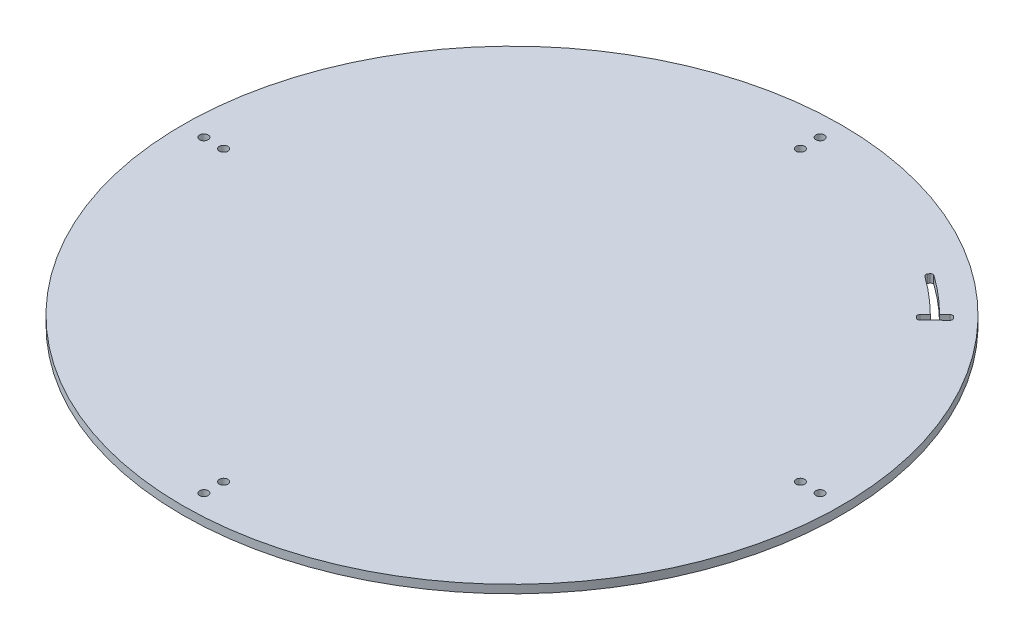
ISO-10303-21;
HEADER;
FILE_DESCRIPTION(('STEP AP214'),'2;1');
FILE_NAME('part.step','',(''),(''),'','','');
FILE_SCHEMA(('AUTOMOTIVE_DESIGN { 1 0 10303 214 1 1 1 1 }'));
ENDSEC;
DATA;
#1=APPLICATION_CONTEXT('core data for automotive mechanical design processes');
#2=APPLICATION_PROTOCOL_DEFINITION('international standard','automotive_design',2000,#1);
#3=PRODUCT_CONTEXT('',#1,'mechanical');
#4=PRODUCT('Part','Part','',(#3));
#5=PRODUCT_RELATED_PRODUCT_CATEGORY('part','',(#4));
#6=PRODUCT_DEFINITION_FORMATION('','',#4);
#7=PRODUCT_DEFINITION_CONTEXT('part definition',#1,'design');
#8=PRODUCT_DEFINITION('design','',#6,#7);
#9=PRODUCT_DEFINITION_SHAPE('','',#8);
#10=(LENGTH_UNIT() NAMED_UNIT(*) SI_UNIT(.MILLI.,.METRE.));
#11=(NAMED_UNIT(*) PLANE_ANGLE_UNIT() SI_UNIT($,.RADIAN.));
#12=(NAMED_UNIT(*) SI_UNIT($,.STERADIAN.) SOLID_ANGLE_UNIT());
#13=UNCERTAINTY_MEASURE_WITH_UNIT(LENGTH_MEASURE(1.E-05),#10,'distance_accuracy_value','');
#14=(GEOMETRIC_REPRESENTATION_CONTEXT(3) GLOBAL_UNCERTAINTY_ASSIGNED_CONTEXT((#13)) GLOBAL_UNIT_ASSIGNED_CONTEXT((#10,
#11,#12)) REPRESENTATION_CONTEXT('',''));
#15=CARTESIAN_POINT('',(0.,0.,0.));
#16=DIRECTION('',(0.,0.,1.));
#17=DIRECTION('',(1.,0.,0.));
#18=AXIS2_PLACEMENT_3D('',#15,#16,#17);
#19=CARTESIAN_POINT('',(0.,5.,0.));
#20=DIRECTION('',(0.,-1.,0.));
#21=DIRECTION('',(0.,0.,-1.));
#22=AXIS2_PLACEMENT_3D('',#19,#20,#21);
#23=CYLINDRICAL_SURFACE('',#22,200.);
#24=CARTESIAN_POINT('',(0.,5.,0.));
#25=DIRECTION('',(0.,1.,0.));
#26=DIRECTION('',(0.,0.,1.));
#27=AXIS2_PLACEMENT_3D('',#24,#25,#26);
#28=CIRCLE('',#27,200.);
#29=CARTESIAN_POINT('',(0.,5.,200.));
#30=VERTEX_POINT('',#29);
#31=EDGE_CURVE('E212',#30,#30,#28,.T.);
#32=ORIENTED_EDGE('',*,*,#31,.F.);
#33=EDGE_LOOP('',(#32));
#34=FACE_BOUND('',#33,.T.);
#35=CARTESIAN_POINT('',(0.,0.,0.));
#36=DIRECTION('',(0.,1.,0.));
#37=DIRECTION('',(0.,0.,1.));
#38=AXIS2_PLACEMENT_3D('',#35,#36,#37);
#39=CIRCLE('',#38,200.);
#40=CARTESIAN_POINT('',(0.,0.,200.));
#41=VERTEX_POINT('',#40);
#42=EDGE_CURVE('E207',#41,#41,#39,.T.);
#43=ORIENTED_EDGE('',*,*,#42,.T.);
#44=EDGE_LOOP('',(#43));
#45=FACE_BOUND('',#44,.T.);
#46=ADVANCED_FACE('F35',(#34,#45),#23,.T.);
#47=CARTESIAN_POINT('',(0.,5.,0.));
#48=DIRECTION('',(0.,1.,0.));
#49=DIRECTION('',(0.,0.,1.));
#50=AXIS2_PLACEMENT_3D('',#47,#48,#49);
#51=PLANE('',#50);
#52=DIRECTION('',(-0.707106781186547,0.,0.707106781186548));
#53=VECTOR('',#52,1.);
#54=CARTESIAN_POINT('',(122.328963701289,5.,-123.036070482476));
#55=LINE('',#54,#53);
#56=CARTESIAN_POINT('',(126.571621417244,5.,-127.27872819843));
#57=VERTEX_POINT('',#56);
#58=CARTESIAN_POINT('',(123.388112995471,5.,-124.095219776657));
#59=VERTEX_POINT('',#58);
#60=EDGE_CURVE('E135',#57,#59,#55,.T.);
#61=ORIENTED_EDGE('',*,*,#60,.F.);
#62=CARTESIAN_POINT('',(0.,5.,0.));
#63=DIRECTION('',(0.,1.,0.));
#64=DIRECTION('',(0.,0.,1.));
#65=AXIS2_PLACEMENT_3D('',#62,#63,#64);
#66=CIRCLE('',#65,179.5);
#67=CARTESIAN_POINT('',(104.737213772786,5.,-145.775052910687));
#68=VERTEX_POINT('',#67);
#69=EDGE_CURVE('E146',#68,#57,#66,.F.);
#70=ORIENTED_EDGE('',*,*,#69,.F.);
#71=CARTESIAN_POINT('',(105.612455113506,5.,-146.993228840303));
#72=DIRECTION('',(0.,1.,0.));
#73=DIRECTION('',(0.,0.,1.));
#74=AXIS2_PLACEMENT_3D('',#71,#72,#73);
#75=CIRCLE('',#74,1.5);
#76=CARTESIAN_POINT('',(104.387067635019,5.,-147.858344744428));
#77=VERTEX_POINT('',#76);
#78=EDGE_CURVE('E236',#68,#77,#75,.F.);
#79=ORIENTED_EDGE('',*,*,#78,.T.);
#80=DIRECTION('',(-0.57674393608276,0.,0.816924985657659));
#81=VECTOR('',#80,1.);
#82=CARTESIAN_POINT('',(0.,5.,0.));
#83=LINE('',#82,#81);
#84=CARTESIAN_POINT('',(104.963831268454,5.,-148.675297630264));
#85=VERTEX_POINT('',#84);
#86=EDGE_CURVE('E155',#85,#77,#83,.T.);
#87=ORIENTED_EDGE('',*,*,#86,.F.);
#88=CARTESIAN_POINT('',(106.18921874694,5.,-147.81018172614));
#89=DIRECTION('',(0.,1.,0.));
#90=DIRECTION('',(0.,0.,1.));
#91=AXIS2_PLACEMENT_3D('',#88,#89,#90);
#92=CIRCLE('',#91,1.5);
#93=CARTESIAN_POINT('',(107.064404615734,5.,-149.028397509597));
#94=VERTEX_POINT('',#93);
#95=EDGE_CURVE('E238',#85,#94,#92,.F.);
#96=ORIENTED_EDGE('',*,*,#95,.T.);
#97=CARTESIAN_POINT('',(0.,5.,0.));
#98=DIRECTION('',(0.,1.,0.));
#99=DIRECTION('',(0.,0.,1.));
#100=AXIS2_PLACEMENT_3D('',#97,#98,#99);
#101=CIRCLE('',#100,183.5);
#102=CARTESIAN_POINT('',(129.400059275875,5.,-130.107166057062));
#103=VERTEX_POINT('',#102);
#104=EDGE_CURVE('E154',#103,#94,#101,.T.);
#105=ORIENTED_EDGE('',*,*,#104,.F.);
#106=CARTESIAN_POINT('',(132.580640856034,5.,-133.28774763722));
#107=VERTEX_POINT('',#106);
#108=EDGE_CURVE('E148',#107,#103,#55,.T.);
#109=ORIENTED_EDGE('',*,*,#108,.F.);
#110=CARTESIAN_POINT('',(133.641301027814,5.,-132.227087465441));
#111=DIRECTION('',(0.,1.,0.));
#112=DIRECTION('',(0.,0.,1.));
#113=AXIS2_PLACEMENT_3D('',#110,#111,#112);
#114=CIRCLE('',#113,1.5);
#115=CARTESIAN_POINT('',(134.707588004099,5.,-133.282090822878));
#116=VERTEX_POINT('',#115);
#117=EDGE_CURVE('E270',#107,#116,#114,.F.);
#118=ORIENTED_EDGE('',*,*,#117,.T.);
#119=CARTESIAN_POINT('',(0.,5.,0.));
#120=DIRECTION('',(0.,1.,0.));
#121=DIRECTION('',(0.,0.,1.));
#122=AXIS2_PLACEMENT_3D('',#119,#120,#121);
#123=CIRCLE('',#122,189.5);
#124=CARTESIAN_POINT('',(135.612762890913,5.,-132.360978166124));
#125=VERTEX_POINT('',#124);
#126=EDGE_CURVE('E149',#125,#116,#123,.T.);
#127=ORIENTED_EDGE('',*,*,#126,.F.);
#128=CARTESIAN_POINT('',(134.539310941908,5.,-131.313265937896));
#129=DIRECTION('',(0.,1.,0.));
#130=DIRECTION('',(0.,0.,1.));
#131=AXIS2_PLACEMENT_3D('',#128,#129,#130);
#132=CIRCLE('',#131,1.5);
#133=CARTESIAN_POINT('',(135.581298497597,5.,-130.234256237388));
#134=VERTEX_POINT('',#133);
#135=EDGE_CURVE('E266',#125,#134,#132,.F.);
#136=ORIENTED_EDGE('',*,*,#135,.T.);
#137=DIRECTION('',(0.71933980033865,0.,-0.694658370458999));
#138=VECTOR('',#137,1.);
#139=CARTESIAN_POINT('',(136.661746850029,5.,-131.277633083091));
#140=LINE('',#139,#138);
#141=CARTESIAN_POINT('',(126.229738971143,5.,-121.203560175752));
#142=VERTEX_POINT('',#141);
#143=EDGE_CURVE('E300',#142,#134,#140,.T.);
#144=ORIENTED_EDGE('',*,*,#143,.F.);
#145=CARTESIAN_POINT('',(125.187751415455,5.,-122.28256987626));
#146=DIRECTION('',(0.,1.,0.));
#147=DIRECTION('',(0.,0.,1.));
#148=AXIS2_PLACEMENT_3D('',#145,#146,#147);
#149=CIRCLE('',#148,1.5);
#150=CARTESIAN_POINT('',(124.114713546179,5.,-121.234433563035));
#151=VERTEX_POINT('',#150);
#152=EDGE_CURVE('E262',#142,#151,#149,.F.);
#153=ORIENTED_EDGE('',*,*,#152,.T.);
#154=CARTESIAN_POINT('',(0.,5.,0.));
#155=DIRECTION('',(0.,-1.,0.));
#156=DIRECTION('',(0.,0.,1.));
#157=AXIS2_PLACEMENT_3D('',#154,#155,#156);
#158=CIRCLE('',#157,173.5);
#159=CARTESIAN_POINT('',(123.382069397246,5.,-121.979977665407));
#160=VERTEX_POINT('',#159);
#161=EDGE_CURVE('E303',#160,#151,#158,.T.);
#162=ORIENTED_EDGE('',*,*,#161,.F.);
#163=CARTESIAN_POINT('',(124.448773167251,5.,-123.034559604878));
#164=DIRECTION('',(0.,1.,0.));
#165=DIRECTION('',(0.,0.,1.));
#166=AXIS2_PLACEMENT_3D('',#163,#164,#165);
#167=CIRCLE('',#166,1.5);
#168=EDGE_CURVE('E43',#160,#59,#167,.F.);
#169=ORIENTED_EDGE('',*,*,#168,.T.);
#170=EDGE_LOOP('',(#61,#70,#79,#87,#96,#105,#109,#118,#127,#136,#144,#153,#162,#169));
#171=FACE_BOUND('',#170,.T.);
#172=CARTESIAN_POINT('',(-187.,5.,1.958721031091E-12));
#173=DIRECTION('',(0.,1.,0.));
#174=DIRECTION('',(-1.,0.,0.));
#175=AXIS2_PLACEMENT_3D('',#172,#173,#174);
#176=CIRCLE('',#175,2.6);
#177=CARTESIAN_POINT('',(-189.6,5.,1.98595458553397E-12));
#178=VERTEX_POINT('',#177);
#179=EDGE_CURVE('E157',#178,#178,#176,.T.);
#180=ORIENTED_EDGE('',*,*,#179,.F.);
#181=EDGE_LOOP('',(#180));
#182=FACE_BOUND('',#181,.T.);
#183=CARTESIAN_POINT('',(187.,5.,-6.52907010363666E-13));
#184=DIRECTION('',(0.,1.,0.));
#185=DIRECTION('',(1.,0.,0.));
#186=AXIS2_PLACEMENT_3D('',#183,#184,#185);
#187=CIRCLE('',#186,2.6);
#188=CARTESIAN_POINT('',(189.6,5.,-6.61984861844658E-13));
#189=VERTEX_POINT('',#188);
#190=EDGE_CURVE('E178',#189,#189,#187,.T.);
#191=ORIENTED_EDGE('',*,*,#190,.F.);
#192=EDGE_LOOP('',(#191));
#193=FACE_BOUND('',#192,.T.);
#194=CARTESIAN_POINT('',(0.,5.,-175.));
#195=DIRECTION('',(0.,1.,0.));
#196=DIRECTION('',(0.,0.,-1.));
#197=AXIS2_PLACEMENT_3D('',#194,#195,#196);
#198=CIRCLE('',#197,2.6);
#199=CARTESIAN_POINT('',(0.,5.,-177.6));
#200=VERTEX_POINT('',#199);
#201=EDGE_CURVE('E171',#200,#200,#198,.T.);
#202=ORIENTED_EDGE('',*,*,#201,.F.);
#203=EDGE_LOOP('',(#202));
#204=FACE_BOUND('',#203,.T.);
#205=CARTESIAN_POINT('',(0.,5.,-187.));
#206=DIRECTION('',(0.,1.,0.));
#207=DIRECTION('',(0.,0.,-1.));
#208=AXIS2_PLACEMENT_3D('',#205,#206,#207);
#209=CIRCLE('',#208,2.6);
#210=CARTESIAN_POINT('',(0.,5.,-189.6));
#211=VERTEX_POINT('',#210);
#212=EDGE_CURVE('E164',#211,#211,#209,.T.);
#213=ORIENTED_EDGE('',*,*,#212,.F.);
#214=EDGE_LOOP('',(#213));
#215=FACE_BOUND('',#214,.T.);
#216=CARTESIAN_POINT('',(-175.,5.,1.83302770289265E-12));
#217=DIRECTION('',(0.,1.,0.));
#218=DIRECTION('',(-1.,0.,0.));
#219=AXIS2_PLACEMENT_3D('',#216,#217,#218);
#220=CIRCLE('',#219,2.6);
#221=CARTESIAN_POINT('',(-177.6,5.,1.86026125733562E-12));
#222=VERTEX_POINT('',#221);
#223=EDGE_CURVE('E172',#222,#222,#220,.T.);
#224=ORIENTED_EDGE('',*,*,#223,.F.);
#225=EDGE_LOOP('',(#224));
#226=FACE_BOUND('',#225,.T.);
#227=CARTESIAN_POINT('',(175.,5.,-6.11009234297548E-13));
#228=DIRECTION('',(0.,1.,0.));
#229=DIRECTION('',(1.,0.,0.));
#230=AXIS2_PLACEMENT_3D('',#227,#228,#229);
#231=CIRCLE('',#230,2.6);
#232=CARTESIAN_POINT('',(177.6,5.,-6.2008708577854E-13));
#233=VERTEX_POINT('',#232);
#234=EDGE_CURVE('E185',#233,#233,#231,.T.);
#235=ORIENTED_EDGE('',*,*,#234,.F.);
#236=EDGE_LOOP('',(#235));
#237=FACE_BOUND('',#236,.T.);
#238=CARTESIAN_POINT('',(0.,5.,175.));
#239=DIRECTION('',(0.,1.,0.));
#240=DIRECTION('',(0.,0.,1.));
#241=AXIS2_PLACEMENT_3D('',#238,#239,#240);
#242=CIRCLE('',#241,2.6);
#243=CARTESIAN_POINT('',(0.,5.,177.6));
#244=VERTEX_POINT('',#243);
#245=EDGE_CURVE('E200',#244,#244,#242,.T.);
#246=ORIENTED_EDGE('',*,*,#245,.F.);
#247=EDGE_LOOP('',(#246));
#248=FACE_BOUND('',#247,.T.);
#249=CARTESIAN_POINT('',(0.,5.,187.));
#250=DIRECTION('',(0.,1.,0.));
#251=DIRECTION('',(0.,0.,1.));
#252=AXIS2_PLACEMENT_3D('',#249,#250,#251);
#253=CIRCLE('',#252,2.6);
#254=CARTESIAN_POINT('',(0.,5.,189.6));
#255=VERTEX_POINT('',#254);
#256=EDGE_CURVE('E199',#255,#255,#253,.T.);
#257=ORIENTED_EDGE('',*,*,#256,.F.);
#258=EDGE_LOOP('',(#257));
#259=FACE_BOUND('',#258,.T.);
#260=ORIENTED_EDGE('',*,*,#31,.T.);
#261=EDGE_LOOP('',(#260));
#262=FACE_BOUND('',#261,.T.);
#263=ADVANCED_FACE('F144',(#171,#182,#193,#204,#215,#226,#237,#248,#259,#262),#51,.T.);
#264=CARTESIAN_POINT('',(0.,0.,0.));
#265=DIRECTION('',(0.,1.,0.));
#266=DIRECTION('',(0.,0.,1.));
#267=AXIS2_PLACEMENT_3D('',#264,#265,#266);
#268=PLANE('',#267);
#269=CARTESIAN_POINT('',(0.,0.,0.));
#270=DIRECTION('',(0.,1.,0.));
#271=DIRECTION('',(0.,0.,1.));
#272=AXIS2_PLACEMENT_3D('',#269,#270,#271);
#273=CIRCLE('',#272,179.5);
#274=CARTESIAN_POINT('',(104.737213772786,0.,-145.775052910687));
#275=VERTEX_POINT('',#274);
#276=CARTESIAN_POINT('',(126.571621417244,0.,-127.27872819843));
#277=VERTEX_POINT('',#276);
#278=EDGE_CURVE('E215',#275,#277,#273,.F.);
#279=ORIENTED_EDGE('',*,*,#278,.T.);
#280=DIRECTION('',(0.707106781186547,0.,-0.707106781186548));
#281=VECTOR('',#280,1.);
#282=CARTESIAN_POINT('',(122.328963701289,0.,-123.036070482476));
#283=LINE('',#282,#281);
#284=CARTESIAN_POINT('',(123.388112995471,0.,-124.095219776657));
#285=VERTEX_POINT('',#284);
#286=EDGE_CURVE('E136',#285,#277,#283,.T.);
#287=ORIENTED_EDGE('',*,*,#286,.F.);
#288=CARTESIAN_POINT('',(124.448773167251,0.,-123.034559604878));
#289=DIRECTION('',(0.,1.,0.));
#290=DIRECTION('',(0.,0.,1.));
#291=AXIS2_PLACEMENT_3D('',#288,#289,#290);
#292=CIRCLE('',#291,1.5);
#293=CARTESIAN_POINT('',(123.382069397246,0.,-121.979977665407));
#294=VERTEX_POINT('',#293);
#295=EDGE_CURVE('E11',#285,#294,#292,.T.);
#296=ORIENTED_EDGE('',*,*,#295,.T.);
#297=CARTESIAN_POINT('',(0.,0.,0.));
#298=DIRECTION('',(0.,1.,0.));
#299=DIRECTION('',(0.,0.,1.));
#300=AXIS2_PLACEMENT_3D('',#297,#298,#299);
#301=CIRCLE('',#300,173.5);
#302=CARTESIAN_POINT('',(124.114713546179,0.,-121.234433563035));
#303=VERTEX_POINT('',#302);
#304=EDGE_CURVE('E291',#303,#294,#301,.T.);
#305=ORIENTED_EDGE('',*,*,#304,.F.);
#306=CARTESIAN_POINT('',(125.187751415455,0.,-122.28256987626));
#307=DIRECTION('',(0.,1.,0.));
#308=DIRECTION('',(0.,0.,1.));
#309=AXIS2_PLACEMENT_3D('',#306,#307,#308);
#310=CIRCLE('',#309,1.5);
#311=CARTESIAN_POINT('',(126.229738971143,0.,-121.203560175752));
#312=VERTEX_POINT('',#311);
#313=EDGE_CURVE('E264',#303,#312,#310,.T.);
#314=ORIENTED_EDGE('',*,*,#313,.T.);
#315=DIRECTION('',(-0.71933980033865,0.,0.694658370458999));
#316=VECTOR('',#315,1.);
#317=CARTESIAN_POINT('',(136.661746850029,0.,-131.277633083091));
#318=LINE('',#317,#316);
#319=CARTESIAN_POINT('',(135.581298497597,0.,-130.234256237388));
#320=VERTEX_POINT('',#319);
#321=EDGE_CURVE('E160',#320,#312,#318,.T.);
#322=ORIENTED_EDGE('',*,*,#321,.F.);
#323=CARTESIAN_POINT('',(134.539310941908,0.,-131.313265937896));
#324=DIRECTION('',(0.,1.,0.));
#325=DIRECTION('',(0.,0.,1.));
#326=AXIS2_PLACEMENT_3D('',#323,#324,#325);
#327=CIRCLE('',#326,1.5);
#328=CARTESIAN_POINT('',(135.612762890913,0.,-132.360978166124));
#329=VERTEX_POINT('',#328);
#330=EDGE_CURVE('E268',#320,#329,#327,.T.);
#331=ORIENTED_EDGE('',*,*,#330,.T.);
#332=CARTESIAN_POINT('',(0.,0.,0.));
#333=DIRECTION('',(0.,1.,0.));
#334=DIRECTION('',(0.,0.,1.));
#335=AXIS2_PLACEMENT_3D('',#332,#333,#334);
#336=CIRCLE('',#335,189.5);
#337=CARTESIAN_POINT('',(134.707588004099,0.,-133.282090822878));
#338=VERTEX_POINT('',#337);
#339=EDGE_CURVE('E283',#338,#329,#336,.F.);
#340=ORIENTED_EDGE('',*,*,#339,.F.);
#341=CARTESIAN_POINT('',(133.641301027814,0.,-132.227087465441));
#342=DIRECTION('',(0.,1.,0.));
#343=DIRECTION('',(0.,0.,1.));
#344=AXIS2_PLACEMENT_3D('',#341,#342,#343);
#345=CIRCLE('',#344,1.5);
#346=CARTESIAN_POINT('',(132.580640856034,0.,-133.28774763722));
#347=VERTEX_POINT('',#346);
#348=EDGE_CURVE('E272',#338,#347,#345,.T.);
#349=ORIENTED_EDGE('',*,*,#348,.T.);
#350=CARTESIAN_POINT('',(129.400059275875,0.,-130.107166057062));
#351=VERTEX_POINT('',#350);
#352=EDGE_CURVE('E280',#351,#347,#283,.T.);
#353=ORIENTED_EDGE('',*,*,#352,.F.);
#354=CARTESIAN_POINT('',(0.,0.,0.));
#355=DIRECTION('',(0.,1.,0.));
#356=DIRECTION('',(0.,0.,1.));
#357=AXIS2_PLACEMENT_3D('',#354,#355,#356);
#358=CIRCLE('',#357,183.5);
#359=CARTESIAN_POINT('',(107.064404615734,0.,-149.028397509597));
#360=VERTEX_POINT('',#359);
#361=EDGE_CURVE('E219',#351,#360,#358,.T.);
#362=ORIENTED_EDGE('',*,*,#361,.T.);
#363=CARTESIAN_POINT('',(106.18921874694,0.,-147.81018172614));
#364=DIRECTION('',(0.,1.,0.));
#365=DIRECTION('',(0.,0.,1.));
#366=AXIS2_PLACEMENT_3D('',#363,#364,#365);
#367=CIRCLE('',#366,1.5);
#368=CARTESIAN_POINT('',(104.963831268454,0.,-148.675297630264));
#369=VERTEX_POINT('',#368);
#370=EDGE_CURVE('E241',#360,#369,#367,.T.);
#371=ORIENTED_EDGE('',*,*,#370,.T.);
#372=DIRECTION('',(-0.57674393608276,0.,0.816924985657659));
#373=VECTOR('',#372,1.);
#374=CARTESIAN_POINT('',(0.,0.,0.));
#375=LINE('',#374,#373);
#376=CARTESIAN_POINT('',(104.387067635019,0.,-147.858344744428));
#377=VERTEX_POINT('',#376);
#378=EDGE_CURVE('E221',#369,#377,#375,.T.);
#379=ORIENTED_EDGE('',*,*,#378,.T.);
#380=CARTESIAN_POINT('',(105.612455113506,0.,-146.993228840303));
#381=DIRECTION('',(0.,1.,0.));
#382=DIRECTION('',(0.,0.,1.));
#383=AXIS2_PLACEMENT_3D('',#380,#381,#382);
#384=CIRCLE('',#383,1.5);
#385=EDGE_CURVE('E234',#377,#275,#384,.T.);
#386=ORIENTED_EDGE('',*,*,#385,.T.);
#387=EDGE_LOOP('',(#279,#287,#296,#305,#314,#322,#331,#340,#349,#353,#362,#371,#379,#386));
#388=FACE_BOUND('',#387,.T.);
#389=CARTESIAN_POINT('',(-187.,0.,1.958721031091E-12));
#390=DIRECTION('',(0.,1.,0.));
#391=DIRECTION('',(0.,0.,1.));
#392=AXIS2_PLACEMENT_3D('',#389,#390,#391);
#393=CIRCLE('',#392,2.6);
#394=CARTESIAN_POINT('',(-187.,0.,2.60000000000196));
#395=VERTEX_POINT('',#394);
#396=EDGE_CURVE('E175',#395,#395,#393,.F.);
#397=ORIENTED_EDGE('',*,*,#396,.F.);
#398=EDGE_LOOP('',(#397));
#399=FACE_BOUND('',#398,.T.);
#400=CARTESIAN_POINT('',(187.,0.,-6.52907010363666E-13));
#401=DIRECTION('',(0.,1.,0.));
#402=DIRECTION('',(0.,0.,1.));
#403=AXIS2_PLACEMENT_3D('',#400,#401,#402);
#404=CIRCLE('',#403,2.6);
#405=CARTESIAN_POINT('',(187.,0.,2.59999999999934));
#406=VERTEX_POINT('',#405);
#407=EDGE_CURVE('E181',#406,#406,#404,.F.);
#408=ORIENTED_EDGE('',*,*,#407,.F.);
#409=EDGE_LOOP('',(#408));
#410=FACE_BOUND('',#409,.T.);
#411=CARTESIAN_POINT('',(0.,0.,-175.));
#412=DIRECTION('',(0.,1.,0.));
#413=DIRECTION('',(0.,0.,1.));
#414=AXIS2_PLACEMENT_3D('',#411,#412,#413);
#415=CIRCLE('',#414,2.6);
#416=CARTESIAN_POINT('',(0.,0.,-172.4));
#417=VERTEX_POINT('',#416);
#418=EDGE_CURVE('E182',#417,#417,#415,.F.);
#419=ORIENTED_EDGE('',*,*,#418,.F.);
#420=EDGE_LOOP('',(#419));
#421=FACE_BOUND('',#420,.T.);
#422=CARTESIAN_POINT('',(0.,0.,-187.));
#423=DIRECTION('',(0.,1.,0.));
#424=DIRECTION('',(0.,0.,1.));
#425=AXIS2_PLACEMENT_3D('',#422,#423,#424);
#426=CIRCLE('',#425,2.6);
#427=CARTESIAN_POINT('',(0.,0.,-184.4));
#428=VERTEX_POINT('',#427);
#429=EDGE_CURVE('E167',#428,#428,#426,.F.);
#430=ORIENTED_EDGE('',*,*,#429,.F.);
#431=EDGE_LOOP('',(#430));
#432=FACE_BOUND('',#431,.T.);
#433=CARTESIAN_POINT('',(-175.,0.,1.83302770289265E-12));
#434=DIRECTION('',(0.,1.,0.));
#435=DIRECTION('',(0.,0.,1.));
#436=AXIS2_PLACEMENT_3D('',#433,#434,#435);
#437=CIRCLE('',#436,2.6);
#438=CARTESIAN_POINT('',(-175.,0.,2.60000000000183));
#439=VERTEX_POINT('',#438);
#440=EDGE_CURVE('E168',#439,#439,#437,.F.);
#441=ORIENTED_EDGE('',*,*,#440,.F.);
#442=EDGE_LOOP('',(#441));
#443=FACE_BOUND('',#442,.T.);
#444=CARTESIAN_POINT('',(175.,0.,-6.11009234297548E-13));
#445=DIRECTION('',(0.,1.,0.));
#446=DIRECTION('',(0.,0.,1.));
#447=AXIS2_PLACEMENT_3D('',#444,#445,#446);
#448=CIRCLE('',#447,2.6);
#449=CARTESIAN_POINT('',(175.,0.,2.59999999999939));
#450=VERTEX_POINT('',#449);
#451=EDGE_CURVE('E196',#450,#450,#448,.F.);
#452=ORIENTED_EDGE('',*,*,#451,.F.);
#453=EDGE_LOOP('',(#452));
#454=FACE_BOUND('',#453,.T.);
#455=CARTESIAN_POINT('',(0.,0.,175.));
#456=DIRECTION('',(0.,1.,0.));
#457=DIRECTION('',(0.,0.,1.));
#458=AXIS2_PLACEMENT_3D('',#455,#456,#457);
#459=CIRCLE('',#458,2.6);
#460=CARTESIAN_POINT('',(0.,0.,177.6));
#461=VERTEX_POINT('',#460);
#462=EDGE_CURVE('E203',#461,#461,#459,.F.);
#463=ORIENTED_EDGE('',*,*,#462,.F.);
#464=EDGE_LOOP('',(#463));
#465=FACE_BOUND('',#464,.T.);
#466=CARTESIAN_POINT('',(0.,0.,187.));
#467=DIRECTION('',(0.,1.,0.));
#468=DIRECTION('',(0.,0.,1.));
#469=AXIS2_PLACEMENT_3D('',#466,#467,#468);
#470=CIRCLE('',#469,2.6);
#471=CARTESIAN_POINT('',(0.,0.,189.6));
#472=VERTEX_POINT('',#471);
#473=EDGE_CURVE('E204',#472,#472,#470,.F.);
#474=ORIENTED_EDGE('',*,*,#473,.F.);
#475=EDGE_LOOP('',(#474));
#476=FACE_BOUND('',#475,.T.);
#477=ORIENTED_EDGE('',*,*,#42,.F.);
#478=EDGE_LOOP('',(#477));
#479=FACE_BOUND('',#478,.T.);
#480=ADVANCED_FACE('F278',(#388,#399,#410,#421,#432,#443,#454,#465,#476,#479),#268,.F.);
#481=CARTESIAN_POINT('',(0.,-0.00100000000000013,187.));
#482=DIRECTION('',(0.,1.,0.));
#483=DIRECTION('',(0.,0.,1.));
#484=AXIS2_PLACEMENT_3D('',#481,#482,#483);
#485=CYLINDRICAL_SURFACE('',#484,2.6);
#486=ORIENTED_EDGE('',*,*,#256,.T.);
#487=EDGE_LOOP('',(#486));
#488=FACE_BOUND('',#487,.T.);
#489=ORIENTED_EDGE('',*,*,#473,.T.);
#490=EDGE_LOOP('',(#489));
#491=FACE_BOUND('',#490,.T.);
#492=ADVANCED_FACE('F432',(#488,#491),#485,.F.);
#493=CARTESIAN_POINT('',(0.,-0.00100000000000013,175.));
#494=DIRECTION('',(0.,1.,0.));
#495=DIRECTION('',(0.,0.,1.));
#496=AXIS2_PLACEMENT_3D('',#493,#494,#495);
#497=CYLINDRICAL_SURFACE('',#496,2.6);
#498=ORIENTED_EDGE('',*,*,#245,.T.);
#499=EDGE_LOOP('',(#498));
#500=FACE_BOUND('',#499,.T.);
#501=ORIENTED_EDGE('',*,*,#462,.T.);
#502=EDGE_LOOP('',(#501));
#503=FACE_BOUND('',#502,.T.);
#504=ADVANCED_FACE('F535',(#500,#503),#497,.F.);
#505=CARTESIAN_POINT('',(175.,-0.00100000000000013,-6.11009234297548E-13));
#506=DIRECTION('',(0.,1.,0.));
#507=DIRECTION('',(0.,0.,1.));
#508=AXIS2_PLACEMENT_3D('',#505,#506,#507);
#509=CYLINDRICAL_SURFACE('',#508,2.6);
#510=ORIENTED_EDGE('',*,*,#234,.T.);
#511=EDGE_LOOP('',(#510));
#512=FACE_BOUND('',#511,.T.);
#513=ORIENTED_EDGE('',*,*,#451,.T.);
#514=EDGE_LOOP('',(#513));
#515=FACE_BOUND('',#514,.T.);
#516=ADVANCED_FACE('F525',(#512,#515),#509,.F.);
#517=CARTESIAN_POINT('',(-175.,-0.00100000000000013,1.83302770289265E-12));
#518=DIRECTION('',(0.,1.,0.));
#519=DIRECTION('',(0.,0.,1.));
#520=AXIS2_PLACEMENT_3D('',#517,#518,#519);
#521=CYLINDRICAL_SURFACE('',#520,2.6);
#522=ORIENTED_EDGE('',*,*,#223,.T.);
#523=EDGE_LOOP('',(#522));
#524=FACE_BOUND('',#523,.T.);
#525=ORIENTED_EDGE('',*,*,#440,.T.);
#526=EDGE_LOOP('',(#525));
#527=FACE_BOUND('',#526,.T.);
#528=ADVANCED_FACE('F515',(#524,#527),#521,.F.);
#529=CARTESIAN_POINT('',(0.,-0.00100000000000013,-187.));
#530=DIRECTION('',(0.,1.,0.));
#531=DIRECTION('',(0.,0.,1.));
#532=AXIS2_PLACEMENT_3D('',#529,#530,#531);
#533=CYLINDRICAL_SURFACE('',#532,2.6);
#534=ORIENTED_EDGE('',*,*,#212,.T.);
#535=EDGE_LOOP('',(#534));
#536=FACE_BOUND('',#535,.T.);
#537=ORIENTED_EDGE('',*,*,#429,.T.);
#538=EDGE_LOOP('',(#537));
#539=FACE_BOUND('',#538,.T.);
#540=ADVANCED_FACE('F505',(#536,#539),#533,.F.);
#541=CARTESIAN_POINT('',(0.,-0.00100000000000013,-175.));
#542=DIRECTION('',(0.,1.,0.));
#543=DIRECTION('',(0.,0.,1.));
#544=AXIS2_PLACEMENT_3D('',#541,#542,#543);
#545=CYLINDRICAL_SURFACE('',#544,2.6);
#546=ORIENTED_EDGE('',*,*,#201,.T.);
#547=EDGE_LOOP('',(#546));
#548=FACE_BOUND('',#547,.T.);
#549=ORIENTED_EDGE('',*,*,#418,.T.);
#550=EDGE_LOOP('',(#549));
#551=FACE_BOUND('',#550,.T.);
#552=ADVANCED_FACE('F495',(#548,#551),#545,.F.);
#553=CARTESIAN_POINT('',(187.,-0.00100000000000013,-6.52907010363666E-13));
#554=DIRECTION('',(0.,1.,0.));
#555=DIRECTION('',(0.,0.,1.));
#556=AXIS2_PLACEMENT_3D('',#553,#554,#555);
#557=CYLINDRICAL_SURFACE('',#556,2.6);
#558=ORIENTED_EDGE('',*,*,#190,.T.);
#559=EDGE_LOOP('',(#558));
#560=FACE_BOUND('',#559,.T.);
#561=ORIENTED_EDGE('',*,*,#407,.T.);
#562=EDGE_LOOP('',(#561));
#563=FACE_BOUND('',#562,.T.);
#564=ADVANCED_FACE('F485',(#560,#563),#557,.F.);
#565=CARTESIAN_POINT('',(-187.,-0.00100000000000013,1.958721031091E-12));
#566=DIRECTION('',(0.,1.,0.));
#567=DIRECTION('',(0.,0.,1.));
#568=AXIS2_PLACEMENT_3D('',#565,#566,#567);
#569=CYLINDRICAL_SURFACE('',#568,2.6);
#570=ORIENTED_EDGE('',*,*,#179,.T.);
#571=EDGE_LOOP('',(#570));
#572=FACE_BOUND('',#571,.T.);
#573=ORIENTED_EDGE('',*,*,#396,.T.);
#574=EDGE_LOOP('',(#573));
#575=FACE_BOUND('',#574,.T.);
#576=ADVANCED_FACE('F459',(#572,#575),#569,.F.);
#577=CARTESIAN_POINT('',(0.,-55.,0.));
#578=DIRECTION('',(0.,-1.,0.));
#579=DIRECTION('',(0.,0.,-1.));
#580=AXIS2_PLACEMENT_3D('',#577,#578,#579);
#581=CYLINDRICAL_SURFACE('',#580,183.5);
#582=ORIENTED_EDGE('',*,*,#361,.F.);
#583=DIRECTION('',(0.,-1.,0.));
#584=VECTOR('',#583,1.);
#585=CARTESIAN_POINT('',(129.400059275875,-55.,-130.107166057062));
#586=LINE('',#585,#584);
#587=EDGE_CURVE('E141',#103,#351,#586,.T.);
#588=ORIENTED_EDGE('',*,*,#587,.F.);
#589=ORIENTED_EDGE('',*,*,#104,.T.);
#590=DIRECTION('',(0.,-1.,0.));
#591=VECTOR('',#590,1.);
#592=CARTESIAN_POINT('',(107.064404615734,-55.,-149.028397509597));
#593=LINE('',#592,#591);
#594=EDGE_CURVE('E231',#94,#360,#593,.T.);
#595=ORIENTED_EDGE('',*,*,#594,.T.);
#596=EDGE_LOOP('',(#582,#588,#589,#595));
#597=FACE_BOUND('',#596,.T.);
#598=ADVANCED_FACE('F449',(#597),#581,.F.);
#599=CARTESIAN_POINT('',(0.,-55.,0.));
#600=DIRECTION('',(0.,-1.,0.));
#601=DIRECTION('',(0.,0.,-1.));
#602=AXIS2_PLACEMENT_3D('',#599,#600,#601);
#603=CYLINDRICAL_SURFACE('',#602,179.5);
#604=ORIENTED_EDGE('',*,*,#69,.T.);
#605=DIRECTION('',(0.,-1.,0.));
#606=VECTOR('',#605,1.);
#607=CARTESIAN_POINT('',(126.571621417244,-55.,-127.27872819843));
#608=LINE('',#607,#606);
#609=EDGE_CURVE('E133',#277,#57,#608,.F.);
#610=ORIENTED_EDGE('',*,*,#609,.F.);
#611=ORIENTED_EDGE('',*,*,#278,.F.);
#612=DIRECTION('',(0.,-1.,0.));
#613=VECTOR('',#612,1.);
#614=CARTESIAN_POINT('',(104.737213772786,-55.,-145.775052910687));
#615=LINE('',#614,#613);
#616=EDGE_CURVE('E153',#275,#68,#615,.F.);
#617=ORIENTED_EDGE('',*,*,#616,.T.);
#618=EDGE_LOOP('',(#604,#610,#611,#617));
#619=FACE_BOUND('',#618,.T.);
#620=ADVANCED_FACE('F151',(#619),#603,.T.);
#621=CARTESIAN_POINT('',(3.51450459781625E-13,0.,2.48121828896407E-13));
#622=DIRECTION('',(-0.816924985657659,0.,-0.57674393608276));
#623=DIRECTION('',(-0.57674393608276,0.,0.816924985657659));
#624=AXIS2_PLACEMENT_3D('',#621,#622,#623);
#625=PLANE('',#624);
#626=ORIENTED_EDGE('',*,*,#86,.T.);
#627=DIRECTION('',(0.,1.,0.));
#628=VECTOR('',#627,1.);
#629=CARTESIAN_POINT('',(104.387067635019,0.,-147.858344744427));
#630=LINE('',#629,#628);
#631=EDGE_CURVE('E227',#77,#377,#630,.F.);
#632=ORIENTED_EDGE('',*,*,#631,.T.);
#633=ORIENTED_EDGE('',*,*,#378,.F.);
#634=DIRECTION('',(0.,1.,0.));
#635=VECTOR('',#634,1.);
#636=CARTESIAN_POINT('',(104.963831268454,5.,-148.675297630264));
#637=LINE('',#636,#635);
#638=EDGE_CURVE('E224',#369,#85,#637,.T.);
#639=ORIENTED_EDGE('',*,*,#638,.T.);
#640=EDGE_LOOP('',(#626,#632,#633,#639));
#641=FACE_BOUND('',#640,.T.);
#642=ADVANCED_FACE('F351',(#641),#625,.F.);
#643=CARTESIAN_POINT('',(105.612455113506,-55.,-146.993228840303));
#644=DIRECTION('',(0.,-1.,0.));
#645=DIRECTION('',(0.,0.,-1.));
#646=AXIS2_PLACEMENT_3D('',#643,#644,#645);
#647=CYLINDRICAL_SURFACE('',#646,1.5);
#648=ORIENTED_EDGE('',*,*,#78,.F.);
#649=ORIENTED_EDGE('',*,*,#616,.F.);
#650=ORIENTED_EDGE('',*,*,#385,.F.);
#651=ORIENTED_EDGE('',*,*,#631,.F.);
#652=EDGE_LOOP('',(#648,#649,#650,#651));
#653=FACE_BOUND('',#652,.T.);
#654=ADVANCED_FACE('F347',(#653),#647,.F.);
#655=CARTESIAN_POINT('',(106.18921874694,-55.,-147.81018172614));
#656=DIRECTION('',(0.,-1.,0.));
#657=DIRECTION('',(0.,0.,-1.));
#658=AXIS2_PLACEMENT_3D('',#655,#656,#657);
#659=CYLINDRICAL_SURFACE('',#658,1.5);
#660=ORIENTED_EDGE('',*,*,#370,.F.);
#661=ORIENTED_EDGE('',*,*,#594,.F.);
#662=ORIENTED_EDGE('',*,*,#95,.F.);
#663=ORIENTED_EDGE('',*,*,#638,.F.);
#664=EDGE_LOOP('',(#660,#661,#662,#663));
#665=FACE_BOUND('',#664,.T.);
#666=ADVANCED_FACE('F350',(#665),#659,.F.);
#667=CARTESIAN_POINT('',(0.,-0.00100000000000013,0.));
#668=DIRECTION('',(0.,1.,0.));
#669=DIRECTION('',(0.,0.,1.));
#670=AXIS2_PLACEMENT_3D('',#667,#668,#669);
#671=CYLINDRICAL_SURFACE('',#670,173.5);
#672=ORIENTED_EDGE('',*,*,#161,.T.);
#673=DIRECTION('',(0.,1.,0.));
#674=VECTOR('',#673,1.);
#675=CARTESIAN_POINT('',(124.114713546179,-0.00100000000000013,-121.234433563035));
#676=LINE('',#675,#674);
#677=EDGE_CURVE('E251',#151,#303,#676,.F.);
#678=ORIENTED_EDGE('',*,*,#677,.T.);
#679=ORIENTED_EDGE('',*,*,#304,.T.);
#680=DIRECTION('',(0.,1.,0.));
#681=VECTOR('',#680,1.);
#682=CARTESIAN_POINT('',(123.382069397246,-0.00100000000000013,-121.979977665407));
#683=LINE('',#682,#681);
#684=EDGE_CURVE('E248',#294,#160,#683,.T.);
#685=ORIENTED_EDGE('',*,*,#684,.T.);
#686=EDGE_LOOP('',(#672,#678,#679,#685));
#687=FACE_BOUND('',#686,.T.);
#688=ADVANCED_FACE('F320',(#687),#671,.T.);
#689=CARTESIAN_POINT('',(122.328963701289,-0.00100000000000013,-123.036070482476));
#690=DIRECTION('',(-0.707106781186548,0.,-0.707106781186547));
#691=DIRECTION('',(-0.707106781186547,0.,0.707106781186548));
#692=AXIS2_PLACEMENT_3D('',#689,#690,#691);
#693=PLANE('',#692);
#694=ORIENTED_EDGE('',*,*,#352,.T.);
#695=DIRECTION('',(0.,-1.,0.));
#696=VECTOR('',#695,1.);
#697=CARTESIAN_POINT('',(132.580640856034,5.,-133.28774763722));
#698=LINE('',#697,#696);
#699=EDGE_CURVE('E258',#347,#107,#698,.F.);
#700=ORIENTED_EDGE('',*,*,#699,.T.);
#701=ORIENTED_EDGE('',*,*,#108,.T.);
#702=ORIENTED_EDGE('',*,*,#587,.T.);
#703=EDGE_LOOP('',(#694,#700,#701,#702));
#704=FACE_BOUND('',#703,.T.);
#705=ADVANCED_FACE('F288',(#704),#693,.F.);
#706=ORIENTED_EDGE('',*,*,#60,.T.);
#707=DIRECTION('',(0.,-1.,0.));
#708=VECTOR('',#707,1.);
#709=CARTESIAN_POINT('',(123.388112995471,0.,-124.095219776657));
#710=LINE('',#709,#708);
#711=EDGE_CURVE('E56',#59,#285,#710,.T.);
#712=ORIENTED_EDGE('',*,*,#711,.T.);
#713=ORIENTED_EDGE('',*,*,#286,.T.);
#714=ORIENTED_EDGE('',*,*,#609,.T.);
#715=EDGE_LOOP('',(#706,#712,#713,#714));
#716=FACE_BOUND('',#715,.T.);
#717=ADVANCED_FACE('F134',(#716),#693,.F.);
#718=CARTESIAN_POINT('',(0.,-0.00100000000000013,0.));
#719=DIRECTION('',(0.,1.,0.));
#720=DIRECTION('',(0.,0.,1.));
#721=AXIS2_PLACEMENT_3D('',#718,#719,#720);
#722=CYLINDRICAL_SURFACE('',#721,189.5);
#723=ORIENTED_EDGE('',*,*,#339,.T.);
#724=DIRECTION('',(0.,1.,0.));
#725=VECTOR('',#724,1.);
#726=CARTESIAN_POINT('',(135.612762890913,-0.00100000000000013,-132.360978166124));
#727=LINE('',#726,#725);
#728=EDGE_CURVE('E255',#329,#125,#727,.T.);
#729=ORIENTED_EDGE('',*,*,#728,.T.);
#730=ORIENTED_EDGE('',*,*,#126,.T.);
#731=DIRECTION('',(0.,1.,0.));
#732=VECTOR('',#731,1.);
#733=CARTESIAN_POINT('',(134.707588004099,-0.00100000000000013,-133.282090822878));
#734=LINE('',#733,#732);
#735=EDGE_CURVE('E253',#116,#338,#734,.F.);
#736=ORIENTED_EDGE('',*,*,#735,.T.);
#737=EDGE_LOOP('',(#723,#729,#730,#736));
#738=FACE_BOUND('',#737,.T.);
#739=ADVANCED_FACE('F298',(#738),#722,.F.);
#740=CARTESIAN_POINT('',(136.661746850029,-0.00100000000000013,-131.277633083091));
#741=DIRECTION('',(0.694658370458999,0.,0.71933980033865));
#742=DIRECTION('',(0.71933980033865,0.,-0.694658370458999));
#743=AXIS2_PLACEMENT_3D('',#740,#741,#742);
#744=PLANE('',#743);
#745=ORIENTED_EDGE('',*,*,#321,.T.);
#746=DIRECTION('',(0.,-1.,0.));
#747=VECTOR('',#746,1.);
#748=CARTESIAN_POINT('',(126.229738971143,5.,-121.203560175752));
#749=LINE('',#748,#747);
#750=EDGE_CURVE('E245',#312,#142,#749,.F.);
#751=ORIENTED_EDGE('',*,*,#750,.T.);
#752=ORIENTED_EDGE('',*,*,#143,.T.);
#753=DIRECTION('',(0.,-1.,0.));
#754=VECTOR('',#753,1.);
#755=CARTESIAN_POINT('',(135.581298497597,0.,-130.234256237388));
#756=LINE('',#755,#754);
#757=EDGE_CURVE('E243',#134,#320,#756,.T.);
#758=ORIENTED_EDGE('',*,*,#757,.T.);
#759=EDGE_LOOP('',(#745,#751,#752,#758));
#760=FACE_BOUND('',#759,.T.);
#761=ADVANCED_FACE('F310',(#760),#744,.F.);
#762=CARTESIAN_POINT('',(125.187751415455,-0.00100000000000013,-122.28256987626));
#763=DIRECTION('',(0.,1.,0.));
#764=DIRECTION('',(0.,0.,1.));
#765=AXIS2_PLACEMENT_3D('',#762,#763,#764);
#766=CYLINDRICAL_SURFACE('',#765,1.5);
#767=ORIENTED_EDGE('',*,*,#313,.F.);
#768=ORIENTED_EDGE('',*,*,#677,.F.);
#769=ORIENTED_EDGE('',*,*,#152,.F.);
#770=ORIENTED_EDGE('',*,*,#750,.F.);
#771=EDGE_LOOP('',(#767,#768,#769,#770));
#772=FACE_BOUND('',#771,.T.);
#773=ADVANCED_FACE('F316',(#772),#766,.F.);
#774=CARTESIAN_POINT('',(134.539310941908,-0.00100000000000013,-131.313265937896));
#775=DIRECTION('',(0.,1.,0.));
#776=DIRECTION('',(0.,0.,1.));
#777=AXIS2_PLACEMENT_3D('',#774,#775,#776);
#778=CYLINDRICAL_SURFACE('',#777,1.5);
#779=ORIENTED_EDGE('',*,*,#330,.F.);
#780=ORIENTED_EDGE('',*,*,#757,.F.);
#781=ORIENTED_EDGE('',*,*,#135,.F.);
#782=ORIENTED_EDGE('',*,*,#728,.F.);
#783=EDGE_LOOP('',(#779,#780,#781,#782));
#784=FACE_BOUND('',#783,.T.);
#785=ADVANCED_FACE('F328',(#784),#778,.F.);
#786=CARTESIAN_POINT('',(133.641301027814,-0.00100000000000013,-132.227087465441));
#787=DIRECTION('',(0.,1.,0.));
#788=DIRECTION('',(0.,0.,1.));
#789=AXIS2_PLACEMENT_3D('',#786,#787,#788);
#790=CYLINDRICAL_SURFACE('',#789,1.5);
#791=ORIENTED_EDGE('',*,*,#348,.F.);
#792=ORIENTED_EDGE('',*,*,#735,.F.);
#793=ORIENTED_EDGE('',*,*,#117,.F.);
#794=ORIENTED_EDGE('',*,*,#699,.F.);
#795=EDGE_LOOP('',(#791,#792,#793,#794));
#796=FACE_BOUND('',#795,.T.);
#797=ADVANCED_FACE('F293',(#796),#790,.F.);
#798=CARTESIAN_POINT('',(124.448773167251,-0.00100000000000013,-123.034559604878));
#799=DIRECTION('',(0.,1.,0.));
#800=DIRECTION('',(0.,0.,1.));
#801=AXIS2_PLACEMENT_3D('',#798,#799,#800);
#802=CYLINDRICAL_SURFACE('',#801,1.5);
#803=ORIENTED_EDGE('',*,*,#295,.F.);
#804=ORIENTED_EDGE('',*,*,#711,.F.);
#805=ORIENTED_EDGE('',*,*,#168,.F.);
#806=ORIENTED_EDGE('',*,*,#684,.F.);
#807=EDGE_LOOP('',(#803,#804,#805,#806));
#808=FACE_BOUND('',#807,.T.);
#809=ADVANCED_FACE('F37',(#808),#802,.F.);
#810=CLOSED_SHELL('',(#46,#263,#480,#492,#504,#516,#528,#540,#552,#564,#576,#598,#620,#642,#654,
#666,#688,#705,#717,#739,#761,#773,#785,#797,#809));
#811=MANIFOLD_SOLID_BREP('B2',#810);
#812=ADVANCED_BREP_SHAPE_REPRESENTATION('',(#18,#811),#14);
#813=SHAPE_DEFINITION_REPRESENTATION(#9,#812);
ENDSEC;
END-ISO-10303-21;
